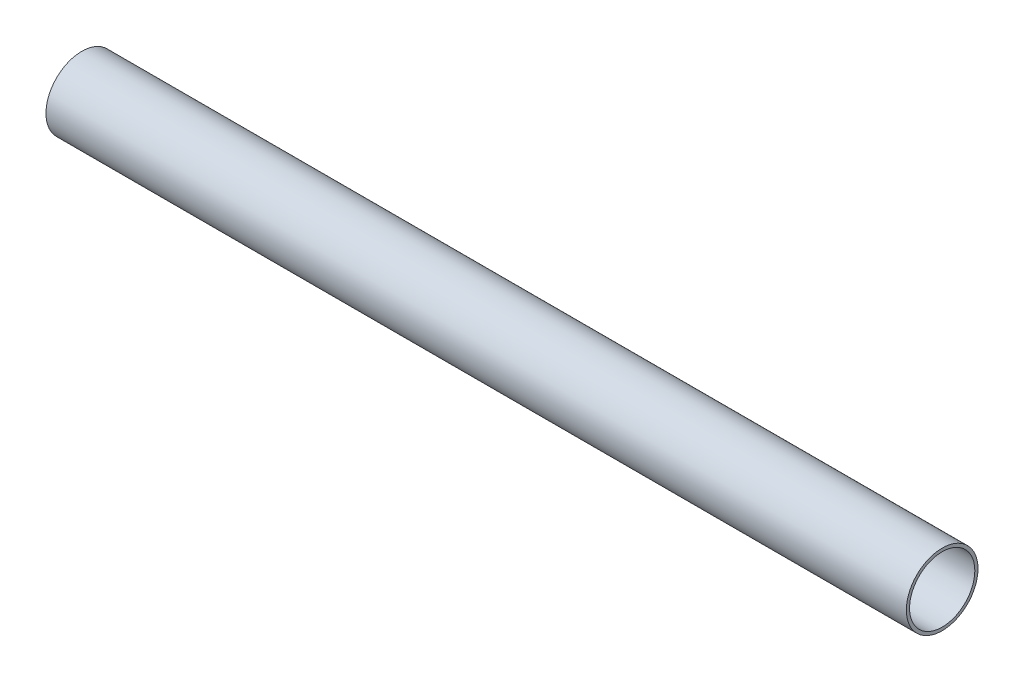
ISO-10303-21;
HEADER;
FILE_DESCRIPTION(('STEP AP214'),'2;1');
FILE_NAME('part.step','',(''),(''),'','','');
FILE_SCHEMA(('AUTOMOTIVE_DESIGN { 1 0 10303 214 1 1 1 1 }'));
ENDSEC;
DATA;
#1=APPLICATION_CONTEXT('core data for automotive mechanical design processes');
#2=APPLICATION_PROTOCOL_DEFINITION('international standard','automotive_design',2000,#1);
#3=PRODUCT_CONTEXT('',#1,'mechanical');
#4=PRODUCT('Part','Part','',(#3));
#5=PRODUCT_RELATED_PRODUCT_CATEGORY('part','',(#4));
#6=PRODUCT_DEFINITION_FORMATION('','',#4);
#7=PRODUCT_DEFINITION_CONTEXT('part definition',#1,'design');
#8=PRODUCT_DEFINITION('design','',#6,#7);
#9=PRODUCT_DEFINITION_SHAPE('','',#8);
#10=(LENGTH_UNIT() NAMED_UNIT(*) SI_UNIT(.MILLI.,.METRE.));
#11=(NAMED_UNIT(*) PLANE_ANGLE_UNIT() SI_UNIT($,.RADIAN.));
#12=(NAMED_UNIT(*) SI_UNIT($,.STERADIAN.) SOLID_ANGLE_UNIT());
#13=UNCERTAINTY_MEASURE_WITH_UNIT(LENGTH_MEASURE(1.E-05),#10,'distance_accuracy_value','');
#14=(GEOMETRIC_REPRESENTATION_CONTEXT(3) GLOBAL_UNCERTAINTY_ASSIGNED_CONTEXT((#13)) GLOBAL_UNIT_ASSIGNED_CONTEXT((#10,
#11,#12)) REPRESENTATION_CONTEXT('',''));
#15=CARTESIAN_POINT('',(0.,0.,0.));
#16=DIRECTION('',(0.,0.,1.));
#17=DIRECTION('',(1.,0.,0.));
#18=AXIS2_PLACEMENT_3D('',#15,#16,#17);
#19=CARTESIAN_POINT('',(137.249916,0.,0.));
#20=DIRECTION('',(1.,0.,0.));
#21=DIRECTION('',(0.,0.,-1.));
#22=AXIS2_PLACEMENT_3D('',#19,#20,#21);
#23=PLANE('',#22);
#24=CARTESIAN_POINT('',(137.249916,0.,0.));
#25=DIRECTION('',(1.,0.,0.));
#26=DIRECTION('',(0.,0.,-1.));
#27=AXIS2_PLACEMENT_3D('',#24,#25,#26);
#28=CIRCLE('',#27,5.715);
#29=CARTESIAN_POINT('',(137.249916,0.,-5.715));
#30=VERTEX_POINT('',#29);
#31=EDGE_CURVE('E11',#30,#30,#28,.T.);
#32=ORIENTED_EDGE('',*,*,#31,.T.);
#33=EDGE_LOOP('',(#32));
#34=FACE_BOUND('',#33,.T.);
#35=CARTESIAN_POINT('',(137.249916,0.,0.));
#36=DIRECTION('',(1.,0.,0.));
#37=DIRECTION('',(0.,0.,-1.));
#38=AXIS2_PLACEMENT_3D('',#35,#36,#37);
#39=CIRCLE('',#38,5.207);
#40=CARTESIAN_POINT('',(137.249916,0.,-5.207));
#41=VERTEX_POINT('',#40);
#42=EDGE_CURVE('E56',#41,#41,#39,.T.);
#43=ORIENTED_EDGE('',*,*,#42,.F.);
#44=EDGE_LOOP('',(#43));
#45=FACE_BOUND('',#44,.T.);
#46=ADVANCED_FACE('F46',(#34,#45),#23,.T.);
#47=CARTESIAN_POINT('',(0.,0.,0.));
#48=DIRECTION('',(1.,0.,0.));
#49=DIRECTION('',(0.,0.,-1.));
#50=AXIS2_PLACEMENT_3D('',#47,#48,#49);
#51=PLANE('',#50);
#52=CARTESIAN_POINT('',(0.,0.,0.));
#53=DIRECTION('',(1.,0.,0.));
#54=DIRECTION('',(0.,0.,-1.));
#55=AXIS2_PLACEMENT_3D('',#52,#53,#54);
#56=CIRCLE('',#55,5.715);
#57=CARTESIAN_POINT('',(0.,0.,-5.715));
#58=VERTEX_POINT('',#57);
#59=EDGE_CURVE('E49',#58,#58,#56,.T.);
#60=ORIENTED_EDGE('',*,*,#59,.F.);
#61=EDGE_LOOP('',(#60));
#62=FACE_BOUND('',#61,.T.);
#63=CARTESIAN_POINT('',(0.,0.,0.));
#64=DIRECTION('',(1.,0.,0.));
#65=DIRECTION('',(0.,0.,-1.));
#66=AXIS2_PLACEMENT_3D('',#63,#64,#65);
#67=CIRCLE('',#66,5.207);
#68=CARTESIAN_POINT('',(0.,0.,-5.207));
#69=VERTEX_POINT('',#68);
#70=EDGE_CURVE('E64',#69,#69,#67,.T.);
#71=ORIENTED_EDGE('',*,*,#70,.T.);
#72=EDGE_LOOP('',(#71));
#73=FACE_BOUND('',#72,.T.);
#74=ADVANCED_FACE('F76',(#62,#73),#51,.F.);
#75=CARTESIAN_POINT('',(137.249916,0.,0.));
#76=DIRECTION('',(-1.,0.,0.));
#77=DIRECTION('',(0.,0.,1.));
#78=AXIS2_PLACEMENT_3D('',#75,#76,#77);
#79=CYLINDRICAL_SURFACE('',#78,5.715);
#80=ORIENTED_EDGE('',*,*,#31,.F.);
#81=EDGE_LOOP('',(#80));
#82=FACE_BOUND('',#81,.T.);
#83=ORIENTED_EDGE('',*,*,#59,.T.);
#84=EDGE_LOOP('',(#83));
#85=FACE_BOUND('',#84,.T.);
#86=ADVANCED_FACE('F48',(#82,#85),#79,.T.);
#87=CARTESIAN_POINT('',(137.249916,0.,0.));
#88=DIRECTION('',(-1.,0.,0.));
#89=DIRECTION('',(0.,0.,1.));
#90=AXIS2_PLACEMENT_3D('',#87,#88,#89);
#91=CYLINDRICAL_SURFACE('',#90,5.207);
#92=ORIENTED_EDGE('',*,*,#42,.T.);
#93=EDGE_LOOP('',(#92));
#94=FACE_BOUND('',#93,.T.);
#95=ORIENTED_EDGE('',*,*,#70,.F.);
#96=EDGE_LOOP('',(#95));
#97=FACE_BOUND('',#96,.T.);
#98=ADVANCED_FACE('F75',(#94,#97),#91,.F.);
#99=CLOSED_SHELL('',(#46,#74,#86,#98));
#100=MANIFOLD_SOLID_BREP('B2',#99);
#101=ADVANCED_BREP_SHAPE_REPRESENTATION('',(#18,#100),#14);
#102=SHAPE_DEFINITION_REPRESENTATION(#9,#101);
ENDSEC;
END-ISO-10303-21;
